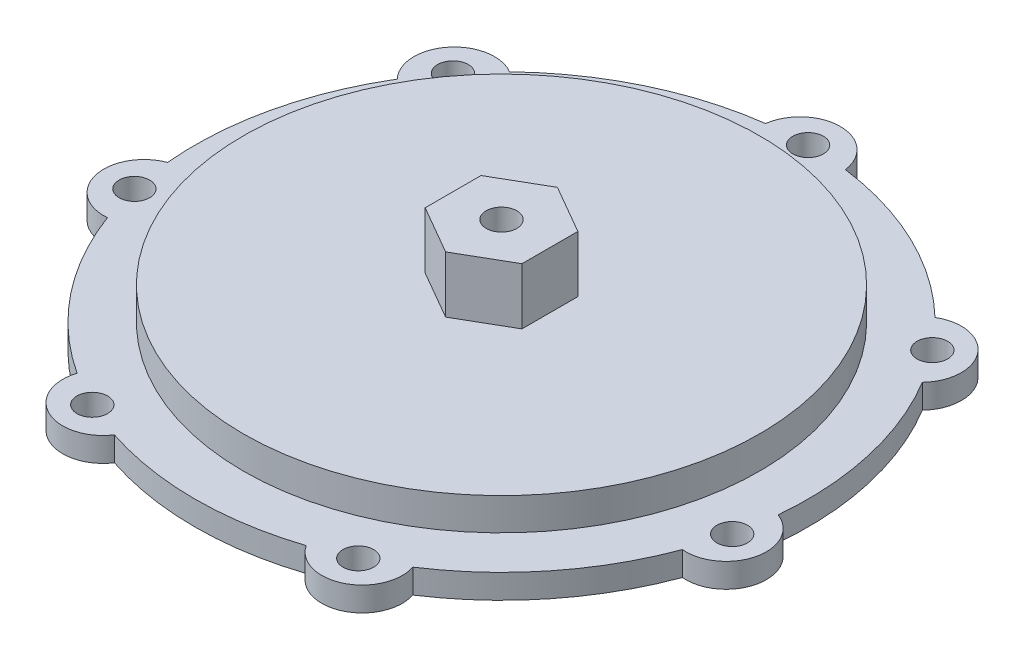
ISO-10303-21;
HEADER;
FILE_DESCRIPTION(('STEP AP214'),'2;1');
FILE_NAME('part.step','',(''),(''),'','','');
FILE_SCHEMA(('AUTOMOTIVE_DESIGN { 1 0 10303 214 1 1 1 1 }'));
ENDSEC;
DATA;
#1=APPLICATION_CONTEXT('core data for automotive mechanical design processes');
#2=APPLICATION_PROTOCOL_DEFINITION('international standard','automotive_design',2000,#1);
#3=PRODUCT_CONTEXT('',#1,'mechanical');
#4=PRODUCT('Part','Part','',(#3));
#5=PRODUCT_RELATED_PRODUCT_CATEGORY('part','',(#4));
#6=PRODUCT_DEFINITION_FORMATION('','',#4);
#7=PRODUCT_DEFINITION_CONTEXT('part definition',#1,'design');
#8=PRODUCT_DEFINITION('design','',#6,#7);
#9=PRODUCT_DEFINITION_SHAPE('','',#8);
#10=(LENGTH_UNIT() NAMED_UNIT(*) SI_UNIT(.MILLI.,.METRE.));
#11=(NAMED_UNIT(*) PLANE_ANGLE_UNIT() SI_UNIT($,.RADIAN.));
#12=(NAMED_UNIT(*) SI_UNIT($,.STERADIAN.) SOLID_ANGLE_UNIT());
#13=UNCERTAINTY_MEASURE_WITH_UNIT(LENGTH_MEASURE(1.E-05),#10,'distance_accuracy_value','');
#14=(GEOMETRIC_REPRESENTATION_CONTEXT(3) GLOBAL_UNCERTAINTY_ASSIGNED_CONTEXT((#13)) GLOBAL_UNIT_ASSIGNED_CONTEXT((#10,
#11,#12)) REPRESENTATION_CONTEXT('',''));
#15=CARTESIAN_POINT('',(0.,0.,0.));
#16=DIRECTION('',(0.,0.,1.));
#17=DIRECTION('',(1.,0.,0.));
#18=AXIS2_PLACEMENT_3D('',#15,#16,#17);
#19=CARTESIAN_POINT('',(0.,7.,0.));
#20=DIRECTION('',(0.,1.,0.));
#21=DIRECTION('',(0.,0.,1.));
#22=AXIS2_PLACEMENT_3D('',#19,#20,#21);
#23=PLANE('',#22);
#24=DIRECTION('',(-0.866025403784439,0.,0.5));
#25=VECTOR('',#24,1.);
#26=CARTESIAN_POINT('',(0.,7.,-6.92820323027551));
#27=LINE('',#26,#25);
#28=CARTESIAN_POINT('',(0.,7.,-6.92820323027551));
#29=VERTEX_POINT('',#28);
#30=CARTESIAN_POINT('',(-6.,7.,-3.46410161513776));
#31=VERTEX_POINT('',#30);
#32=EDGE_CURVE('E1307',#29,#31,#27,.T.);
#33=ORIENTED_EDGE('',*,*,#32,.F.);
#34=DIRECTION('',(-0.866025403784439,0.,-0.5));
#35=VECTOR('',#34,1.);
#36=CARTESIAN_POINT('',(6.,7.,-3.46410161513776));
#37=LINE('',#36,#35);
#38=CARTESIAN_POINT('',(6.,7.,-3.46410161513776));
#39=VERTEX_POINT('',#38);
#40=EDGE_CURVE('E1289',#39,#29,#37,.T.);
#41=ORIENTED_EDGE('',*,*,#40,.F.);
#42=DIRECTION('',(0.,0.,-1.));
#43=VECTOR('',#42,1.);
#44=CARTESIAN_POINT('',(6.,7.,3.46410161513776));
#45=LINE('',#44,#43);
#46=CARTESIAN_POINT('',(6.,7.,3.46410161513776));
#47=VERTEX_POINT('',#46);
#48=EDGE_CURVE('E1294',#47,#39,#45,.T.);
#49=ORIENTED_EDGE('',*,*,#48,.F.);
#50=DIRECTION('',(0.866025403784439,0.,-0.5));
#51=VECTOR('',#50,1.);
#52=CARTESIAN_POINT('',(0.,7.,6.92820323027551));
#53=LINE('',#52,#51);
#54=CARTESIAN_POINT('',(0.,7.,6.92820323027551));
#55=VERTEX_POINT('',#54);
#56=EDGE_CURVE('E1313',#55,#47,#53,.T.);
#57=ORIENTED_EDGE('',*,*,#56,.F.);
#58=DIRECTION('',(0.866025403784438,0.,0.5));
#59=VECTOR('',#58,1.);
#60=CARTESIAN_POINT('',(-6.,7.,3.46410161513775));
#61=LINE('',#60,#59);
#62=CARTESIAN_POINT('',(-6.,7.,3.46410161513775));
#63=VERTEX_POINT('',#62);
#64=EDGE_CURVE('E1311',#63,#55,#61,.T.);
#65=ORIENTED_EDGE('',*,*,#64,.F.);
#66=DIRECTION('',(0.,0.,1.));
#67=VECTOR('',#66,1.);
#68=CARTESIAN_POINT('',(-6.,7.,-3.46410161513776));
#69=LINE('',#68,#67);
#70=EDGE_CURVE('E1309',#31,#63,#69,.T.);
#71=ORIENTED_EDGE('',*,*,#70,.F.);
#72=EDGE_LOOP('',(#33,#41,#49,#57,#65,#71));
#73=FACE_BOUND('',#72,.T.);
#74=CARTESIAN_POINT('',(0.,7.00000000000001,0.));
#75=DIRECTION('',(0.,1.,0.));
#76=DIRECTION('',(0.,0.,1.));
#77=AXIS2_PLACEMENT_3D('',#74,#75,#76);
#78=CIRCLE('',#77,32.);
#79=CARTESIAN_POINT('',(0.,7.00000000000001,32.));
#80=VERTEX_POINT('',#79);
#81=EDGE_CURVE('E1003',#80,#80,#78,.T.);
#82=ORIENTED_EDGE('',*,*,#81,.T.);
#83=EDGE_LOOP('',(#82));
#84=FACE_BOUND('',#83,.T.);
#85=ADVANCED_FACE('F999',(#73,#84),#23,.T.);
#86=CARTESIAN_POINT('',(0.,7.,0.));
#87=DIRECTION('',(0.,-1.,0.));
#88=DIRECTION('',(0.,0.,-1.));
#89=AXIS2_PLACEMENT_3D('',#86,#87,#88);
#90=CYLINDRICAL_SURFACE('',#89,38.);
#91=CARTESIAN_POINT('',(0.,3.,0.));
#92=DIRECTION('',(0.,1.,0.));
#93=DIRECTION('',(0.,0.,1.));
#94=AXIS2_PLACEMENT_3D('',#91,#92,#93);
#95=CIRCLE('',#94,38.);
#96=CARTESIAN_POINT('',(-4.95413588643874,3.,-37.6756756756757));
#97=VERTEX_POINT('',#96);
#98=CARTESIAN_POINT('',(-26.3671761642809,3.,-27.3636989663637));
#99=VERTEX_POINT('',#98);
#100=EDGE_CURVE('E1147',#97,#99,#95,.T.);
#101=ORIENTED_EDGE('',*,*,#100,.F.);
#102=DIRECTION('',(0.,-1.,0.));
#103=VECTOR('',#102,1.);
#104=CARTESIAN_POINT('',(-4.95413588643874,41.8108108108108,-37.6756756756757));
#105=LINE('',#104,#103);
#106=CARTESIAN_POINT('',(-4.95413588643874,0.,-37.6756756756757));
#107=VERTEX_POINT('',#106);
#108=EDGE_CURVE('E1024',#97,#107,#105,.T.);
#109=ORIENTED_EDGE('',*,*,#108,.T.);
#110=CARTESIAN_POINT('',(0.,0.,0.));
#111=DIRECTION('',(0.,1.,0.));
#112=DIRECTION('',(0.,0.,1.));
#113=AXIS2_PLACEMENT_3D('',#110,#111,#112);
#114=CIRCLE('',#113,38.);
#115=CARTESIAN_POINT('',(-26.3671761642809,0.,-27.3636989663637));
#116=VERTEX_POINT('',#115);
#117=EDGE_CURVE('E13',#107,#116,#114,.T.);
#118=ORIENTED_EDGE('',*,*,#117,.T.);
#119=DIRECTION('',(0.,-1.,0.));
#120=VECTOR('',#119,1.);
#121=CARTESIAN_POINT('',(-26.3671761642809,42.3401581040992,-27.3636989663637));
#122=LINE('',#121,#120);
#123=EDGE_CURVE('E1164',#99,#116,#122,.T.);
#124=ORIENTED_EDGE('',*,*,#123,.F.);
#125=EDGE_LOOP('',(#101,#109,#118,#124));
#126=FACE_BOUND('',#125,.T.);
#127=ADVANCED_FACE('F1001',(#126),#90,.T.);
#128=CARTESIAN_POINT('',(0.,3.,0.));
#129=DIRECTION('',(0.,1.,0.));
#130=DIRECTION('',(0.,0.,1.));
#131=AXIS2_PLACEMENT_3D('',#128,#129,#130);
#132=CIRCLE('',#131,38.);
#133=CARTESIAN_POINT('',(-32.5448825687149,3.,-19.6171001574789));
#134=VERTEX_POINT('',#133);
#135=CARTESIAN_POINT('',(-37.8334667709229,3.,3.55370118235541));
#136=VERTEX_POINT('',#135);
#137=EDGE_CURVE('E1145',#134,#136,#132,.T.);
#138=ORIENTED_EDGE('',*,*,#137,.F.);
#139=DIRECTION('',(0.,-1.,0.));
#140=VECTOR('',#139,1.);
#141=CARTESIAN_POINT('',(-32.5448825687149,42.3401581040992,-19.6171001574789));
#142=LINE('',#141,#140);
#143=CARTESIAN_POINT('',(-32.5448825687149,0.,-19.6171001574789));
#144=VERTEX_POINT('',#143);
#145=EDGE_CURVE('E1156',#134,#144,#142,.T.);
#146=ORIENTED_EDGE('',*,*,#145,.T.);
#147=CARTESIAN_POINT('',(-37.8334667709229,0.,3.55370118235541));
#148=VERTEX_POINT('',#147);
#149=EDGE_CURVE('E1008',#144,#148,#114,.T.);
#150=ORIENTED_EDGE('',*,*,#149,.T.);
#151=DIRECTION('',(0.,-1.,0.));
#152=VECTOR('',#151,1.);
#153=CARTESIAN_POINT('',(-37.8334667709229,42.1052968000622,3.55370118235541));
#154=LINE('',#153,#152);
#155=EDGE_CURVE('E1158',#136,#148,#154,.T.);
#156=ORIENTED_EDGE('',*,*,#155,.F.);
#157=EDGE_LOOP('',(#138,#146,#150,#156));
#158=FACE_BOUND('',#157,.T.);
#159=ADVANCED_FACE('F1154',(#158),#90,.T.);
#160=CARTESIAN_POINT('',(0.,3.,0.));
#161=DIRECTION('',(0.,1.,0.));
#162=DIRECTION('',(0.,0.,1.));
#163=AXIS2_PLACEMENT_3D('',#160,#161,#162);
#164=CIRCLE('',#163,38.);
#165=CARTESIAN_POINT('',(-35.6286688821293,3.,13.213551895217));
#166=VERTEX_POINT('',#165);
#167=CARTESIAN_POINT('',(-20.8103852369823,3.,31.7950918584675));
#168=VERTEX_POINT('',#167);
#169=EDGE_CURVE('E1245',#166,#168,#164,.T.);
#170=ORIENTED_EDGE('',*,*,#169,.F.);
#171=DIRECTION('',(0.,-1.,0.));
#172=VECTOR('',#171,1.);
#173=CARTESIAN_POINT('',(-35.6286688821293,42.1052968000622,13.213551895217));
#174=LINE('',#173,#172);
#175=CARTESIAN_POINT('',(-35.6286688821293,0.,13.213551895217));
#176=VERTEX_POINT('',#175);
#177=EDGE_CURVE('E1179',#166,#176,#174,.T.);
#178=ORIENTED_EDGE('',*,*,#177,.T.);
#179=CARTESIAN_POINT('',(-20.8103852369823,0.,31.7950918584675));
#180=VERTEX_POINT('',#179);
#181=EDGE_CURVE('E1676',#176,#180,#114,.T.);
#182=ORIENTED_EDGE('',*,*,#181,.T.);
#183=DIRECTION('',(0.,-1.,0.));
#184=VECTOR('',#183,1.);
#185=CARTESIAN_POINT('',(-20.8103852369823,42.2639668536134,31.7950918584675));
#186=LINE('',#185,#184);
#187=EDGE_CURVE('E1175',#168,#180,#186,.T.);
#188=ORIENTED_EDGE('',*,*,#187,.F.);
#189=EDGE_LOOP('',(#170,#178,#182,#188));
#190=FACE_BOUND('',#189,.T.);
#191=ADVANCED_FACE('F1632',(#190),#90,.T.);
#192=CARTESIAN_POINT('',(0.,3.,0.));
#193=DIRECTION('',(0.,1.,0.));
#194=DIRECTION('',(0.,0.,1.));
#195=AXIS2_PLACEMENT_3D('',#192,#193,#194);
#196=CIRCLE('',#195,38.);
#197=CARTESIAN_POINT('',(-11.8833408349034,3.,36.0941298634767));
#198=VERTEX_POINT('',#197);
#199=CARTESIAN_POINT('',(11.8833408349029,3.,36.0941298634768));
#200=VERTEX_POINT('',#199);
#201=EDGE_CURVE('E1255',#198,#200,#196,.T.);
#202=ORIENTED_EDGE('',*,*,#201,.F.);
#203=DIRECTION('',(0.,-1.,0.));
#204=VECTOR('',#203,1.);
#205=CARTESIAN_POINT('',(-11.8833408349034,42.2639668536134,36.0941298634767));
#206=LINE('',#205,#204);
#207=CARTESIAN_POINT('',(-11.8833408349034,0.,36.0941298634767));
#208=VERTEX_POINT('',#207);
#209=EDGE_CURVE('E1189',#198,#208,#206,.T.);
#210=ORIENTED_EDGE('',*,*,#209,.T.);
#211=CARTESIAN_POINT('',(11.8833408349029,0.,36.0941298634768));
#212=VERTEX_POINT('',#211);
#213=EDGE_CURVE('E1680',#208,#212,#114,.T.);
#214=ORIENTED_EDGE('',*,*,#213,.T.);
#215=DIRECTION('',(0.,-1.,0.));
#216=VECTOR('',#215,1.);
#217=CARTESIAN_POINT('',(11.8833408349029,42.2639668536134,36.0941298634768));
#218=LINE('',#217,#216);
#219=EDGE_CURVE('E1185',#200,#212,#218,.T.);
#220=ORIENTED_EDGE('',*,*,#219,.F.);
#221=EDGE_LOOP('',(#202,#210,#214,#220));
#222=FACE_BOUND('',#221,.T.);
#223=ADVANCED_FACE('F1622',(#222),#90,.T.);
#224=CARTESIAN_POINT('',(0.,3.,0.));
#225=DIRECTION('',(0.,1.,0.));
#226=DIRECTION('',(0.,0.,1.));
#227=AXIS2_PLACEMENT_3D('',#224,#225,#226);
#228=CIRCLE('',#227,38.);
#229=CARTESIAN_POINT('',(20.8103852369819,3.,31.7950918584678));
#230=VERTEX_POINT('',#229);
#231=CARTESIAN_POINT('',(35.6286688821291,3.,13.2135518952175));
#232=VERTEX_POINT('',#231);
#233=EDGE_CURVE('E1262',#230,#232,#228,.T.);
#234=ORIENTED_EDGE('',*,*,#233,.F.);
#235=DIRECTION('',(0.,-1.,0.));
#236=VECTOR('',#235,1.);
#237=CARTESIAN_POINT('',(20.8103852369819,42.2639668536134,31.7950918584678));
#238=LINE('',#237,#236);
#239=CARTESIAN_POINT('',(20.8103852369819,0.,31.7950918584678));
#240=VERTEX_POINT('',#239);
#241=EDGE_CURVE('E1199',#230,#240,#238,.T.);
#242=ORIENTED_EDGE('',*,*,#241,.T.);
#243=CARTESIAN_POINT('',(35.6286688821291,0.,13.2135518952175));
#244=VERTEX_POINT('',#243);
#245=EDGE_CURVE('E1682',#240,#244,#114,.T.);
#246=ORIENTED_EDGE('',*,*,#245,.T.);
#247=DIRECTION('',(0.,-1.,0.));
#248=VECTOR('',#247,1.);
#249=CARTESIAN_POINT('',(35.6286688821291,42.1052968000622,13.2135518952175));
#250=LINE('',#249,#248);
#251=EDGE_CURVE('E1195',#232,#244,#250,.T.);
#252=ORIENTED_EDGE('',*,*,#251,.F.);
#253=EDGE_LOOP('',(#234,#242,#246,#252));
#254=FACE_BOUND('',#253,.T.);
#255=ADVANCED_FACE('F1612',(#254),#90,.T.);
#256=CARTESIAN_POINT('',(0.,3.,0.));
#257=DIRECTION('',(0.,1.,0.));
#258=DIRECTION('',(0.,0.,1.));
#259=AXIS2_PLACEMENT_3D('',#256,#257,#258);
#260=CIRCLE('',#259,38.);
#261=CARTESIAN_POINT('',(37.8334667709228,3.,3.55370118235592));
#262=VERTEX_POINT('',#261);
#263=CARTESIAN_POINT('',(32.5448825687152,3.,-19.6171001574784));
#264=VERTEX_POINT('',#263);
#265=EDGE_CURVE('E1251',#262,#264,#260,.T.);
#266=ORIENTED_EDGE('',*,*,#265,.F.);
#267=DIRECTION('',(0.,-1.,0.));
#268=VECTOR('',#267,1.);
#269=CARTESIAN_POINT('',(37.8334667709228,42.1052968000622,3.55370118235592));
#270=LINE('',#269,#268);
#271=CARTESIAN_POINT('',(37.8334667709228,0.,3.55370118235592));
#272=VERTEX_POINT('',#271);
#273=EDGE_CURVE('E1209',#262,#272,#270,.T.);
#274=ORIENTED_EDGE('',*,*,#273,.T.);
#275=CARTESIAN_POINT('',(32.5448825687152,0.,-19.6171001574784));
#276=VERTEX_POINT('',#275);
#277=EDGE_CURVE('E1685',#272,#276,#114,.T.);
#278=ORIENTED_EDGE('',*,*,#277,.T.);
#279=DIRECTION('',(0.,-1.,0.));
#280=VECTOR('',#279,1.);
#281=CARTESIAN_POINT('',(32.5448825687152,42.3401581040992,-19.6171001574784));
#282=LINE('',#281,#280);
#283=EDGE_CURVE('E1205',#264,#276,#282,.T.);
#284=ORIENTED_EDGE('',*,*,#283,.F.);
#285=EDGE_LOOP('',(#266,#274,#278,#284));
#286=FACE_BOUND('',#285,.T.);
#287=ADVANCED_FACE('F1602',(#286),#90,.T.);
#288=CARTESIAN_POINT('',(0.,3.,0.));
#289=DIRECTION('',(0.,1.,0.));
#290=DIRECTION('',(0.,0.,1.));
#291=AXIS2_PLACEMENT_3D('',#288,#289,#290);
#292=CIRCLE('',#291,38.);
#293=CARTESIAN_POINT('',(26.3671761642813,3.,-27.3636989663634));
#294=VERTEX_POINT('',#293);
#295=CARTESIAN_POINT('',(4.95413588643874,3.,-37.6756756756757));
#296=VERTEX_POINT('',#295);
#297=EDGE_CURVE('E1241',#294,#296,#292,.T.);
#298=ORIENTED_EDGE('',*,*,#297,.F.);
#299=DIRECTION('',(0.,-1.,0.));
#300=VECTOR('',#299,1.);
#301=CARTESIAN_POINT('',(26.3671761642813,42.3401581040992,-27.3636989663634));
#302=LINE('',#301,#300);
#303=CARTESIAN_POINT('',(26.3671761642813,0.,-27.3636989663634));
#304=VERTEX_POINT('',#303);
#305=EDGE_CURVE('E1219',#294,#304,#302,.T.);
#306=ORIENTED_EDGE('',*,*,#305,.T.);
#307=CARTESIAN_POINT('',(4.95413588643874,0.,-37.6756756756757));
#308=VERTEX_POINT('',#307);
#309=EDGE_CURVE('E1010',#304,#308,#114,.T.);
#310=ORIENTED_EDGE('',*,*,#309,.T.);
#311=DIRECTION('',(0.,-1.,0.));
#312=VECTOR('',#311,1.);
#313=CARTESIAN_POINT('',(4.95413588643874,41.8108108108108,-37.6756756756757));
#314=LINE('',#313,#312);
#315=EDGE_CURVE('E1215',#296,#308,#314,.T.);
#316=ORIENTED_EDGE('',*,*,#315,.F.);
#317=EDGE_LOOP('',(#298,#306,#310,#316));
#318=FACE_BOUND('',#317,.T.);
#319=ADVANCED_FACE('F1352',(#318),#90,.T.);
#320=CARTESIAN_POINT('',(0.,41.8108108108108,-37.));
#321=DIRECTION('',(0.,-1.,0.));
#322=DIRECTION('',(0.,0.,-1.));
#323=AXIS2_PLACEMENT_3D('',#320,#321,#322);
#324=CYLINDRICAL_SURFACE('',#323,5.);
#325=ORIENTED_EDGE('',*,*,#108,.F.);
#326=CARTESIAN_POINT('',(0.,3.,-37.));
#327=DIRECTION('',(0.,1.,0.));
#328=DIRECTION('',(0.,0.,1.));
#329=AXIS2_PLACEMENT_3D('',#326,#327,#328);
#330=CIRCLE('',#329,5.);
#331=EDGE_CURVE('E1238',#97,#296,#330,.F.);
#332=ORIENTED_EDGE('',*,*,#331,.T.);
#333=ORIENTED_EDGE('',*,*,#315,.T.);
#334=CARTESIAN_POINT('',(0.,0.,-37.));
#335=DIRECTION('',(0.,1.,0.));
#336=DIRECTION('',(0.,0.,1.));
#337=AXIS2_PLACEMENT_3D('',#334,#335,#336);
#338=CIRCLE('',#337,5.);
#339=EDGE_CURVE('E1225',#107,#308,#338,.F.);
#340=ORIENTED_EDGE('',*,*,#339,.F.);
#341=EDGE_LOOP('',(#325,#332,#333,#340));
#342=FACE_BOUND('',#341,.T.);
#343=ADVANCED_FACE('F1356',(#342),#324,.T.);
#344=CARTESIAN_POINT('',(0.,41.8108108108108,-38.));
#345=DIRECTION('',(0.,-1.,0.));
#346=DIRECTION('',(0.,0.,-1.));
#347=AXIS2_PLACEMENT_3D('',#344,#345,#346);
#348=CYLINDRICAL_SURFACE('',#347,1.9);
#349=CARTESIAN_POINT('',(0.,0.,-38.));
#350=DIRECTION('',(0.,1.,0.));
#351=DIRECTION('',(0.,0.,1.));
#352=AXIS2_PLACEMENT_3D('',#349,#350,#351);
#353=CIRCLE('',#352,1.9);
#354=CARTESIAN_POINT('',(0.,0.,-36.1));
#355=VERTEX_POINT('',#354);
#356=EDGE_CURVE('E1222',#355,#355,#353,.T.);
#357=ORIENTED_EDGE('',*,*,#356,.F.);
#358=EDGE_LOOP('',(#357));
#359=FACE_BOUND('',#358,.T.);
#360=CARTESIAN_POINT('',(0.,3.,-38.));
#361=DIRECTION('',(0.,1.,0.));
#362=DIRECTION('',(0.,0.,1.));
#363=AXIS2_PLACEMENT_3D('',#360,#361,#362);
#364=CIRCLE('',#363,1.9);
#365=CARTESIAN_POINT('',(0.,3.,-36.1));
#366=VERTEX_POINT('',#365);
#367=EDGE_CURVE('E1280',#366,#366,#364,.T.);
#368=ORIENTED_EDGE('',*,*,#367,.T.);
#369=EDGE_LOOP('',(#368));
#370=FACE_BOUND('',#369,.T.);
#371=ADVANCED_FACE('F1359',(#359,#370),#348,.F.);
#372=CARTESIAN_POINT('',(28.9277648513172,42.3401581040992,-23.0691226687731));
#373=DIRECTION('',(0.,-1.,0.));
#374=DIRECTION('',(0.,0.,-1.));
#375=AXIS2_PLACEMENT_3D('',#372,#373,#374);
#376=CYLINDRICAL_SURFACE('',#375,5.);
#377=ORIENTED_EDGE('',*,*,#305,.F.);
#378=CARTESIAN_POINT('',(28.9277648513172,3.,-23.0691226687731));
#379=DIRECTION('',(0.,1.,0.));
#380=DIRECTION('',(0.,0.,1.));
#381=AXIS2_PLACEMENT_3D('',#378,#379,#380);
#382=CIRCLE('',#381,5.);
#383=EDGE_CURVE('E1248',#294,#264,#382,.F.);
#384=ORIENTED_EDGE('',*,*,#383,.T.);
#385=ORIENTED_EDGE('',*,*,#283,.T.);
#386=CARTESIAN_POINT('',(28.9277648513172,0.,-23.0691226687731));
#387=DIRECTION('',(0.,1.,0.));
#388=DIRECTION('',(-0.781831482468031,0.,0.623489801858732));
#389=AXIS2_PLACEMENT_3D('',#386,#387,#388);
#390=CIRCLE('',#389,5.);
#391=EDGE_CURVE('E1216',#304,#276,#390,.F.);
#392=ORIENTED_EDGE('',*,*,#391,.F.);
#393=EDGE_LOOP('',(#377,#384,#385,#392));
#394=FACE_BOUND('',#393,.T.);
#395=ADVANCED_FACE('F1363',(#394),#376,.T.);
#396=CARTESIAN_POINT('',(29.7095963337852,42.3401581040992,-23.6926124706318));
#397=DIRECTION('',(0.,-1.,0.));
#398=DIRECTION('',(0.,0.,-1.));
#399=AXIS2_PLACEMENT_3D('',#396,#397,#398);
#400=CYLINDRICAL_SURFACE('',#399,1.9);
#401=CARTESIAN_POINT('',(29.7095963337852,0.,-23.6926124706318));
#402=DIRECTION('',(0.,1.,0.));
#403=DIRECTION('',(-0.781831482468031,0.,0.623489801858732));
#404=AXIS2_PLACEMENT_3D('',#401,#402,#403);
#405=CIRCLE('',#404,1.9);
#406=CARTESIAN_POINT('',(28.2241165170959,0.,-22.5079818471002));
#407=VERTEX_POINT('',#406);
#408=EDGE_CURVE('E1212',#407,#407,#405,.T.);
#409=ORIENTED_EDGE('',*,*,#408,.F.);
#410=EDGE_LOOP('',(#409));
#411=FACE_BOUND('',#410,.T.);
#412=CARTESIAN_POINT('',(29.7095963337852,3.,-23.6926124706318));
#413=DIRECTION('',(0.,1.,0.));
#414=DIRECTION('',(0.,0.,1.));
#415=AXIS2_PLACEMENT_3D('',#412,#413,#414);
#416=CIRCLE('',#415,1.9);
#417=CARTESIAN_POINT('',(29.7095963337852,3.,-21.7926124706318));
#418=VERTEX_POINT('',#417);
#419=EDGE_CURVE('E1277',#418,#418,#416,.T.);
#420=ORIENTED_EDGE('',*,*,#419,.T.);
#421=EDGE_LOOP('',(#420));
#422=FACE_BOUND('',#421,.T.);
#423=ADVANCED_FACE('F1367',(#411,#422),#400,.F.);
#424=CARTESIAN_POINT('',(36.0723327507274,42.1052968000622,8.23327455638378));
#425=DIRECTION('',(0.,-1.,0.));
#426=DIRECTION('',(0.,0.,-1.));
#427=AXIS2_PLACEMENT_3D('',#424,#425,#426);
#428=CYLINDRICAL_SURFACE('',#427,5.);
#429=ORIENTED_EDGE('',*,*,#273,.F.);
#430=CARTESIAN_POINT('',(36.0723327507274,3.,8.23327455638378));
#431=DIRECTION('',(0.,1.,0.));
#432=DIRECTION('',(0.,0.,1.));
#433=AXIS2_PLACEMENT_3D('',#430,#431,#432);
#434=CIRCLE('',#433,5.);
#435=EDGE_CURVE('E1260',#262,#232,#434,.F.);
#436=ORIENTED_EDGE('',*,*,#435,.T.);
#437=ORIENTED_EDGE('',*,*,#251,.T.);
#438=CARTESIAN_POINT('',(36.0723327507274,0.,8.23327455638378));
#439=DIRECTION('',(0.,1.,0.));
#440=DIRECTION('',(-0.974927912181823,0.,-0.222520933956318));
#441=AXIS2_PLACEMENT_3D('',#438,#439,#440);
#442=CIRCLE('',#441,5.);
#443=EDGE_CURVE('E1206',#272,#244,#442,.F.);
#444=ORIENTED_EDGE('',*,*,#443,.F.);
#445=EDGE_LOOP('',(#429,#436,#437,#444));
#446=FACE_BOUND('',#445,.T.);
#447=ADVANCED_FACE('F1371',(#446),#428,.T.);
#448=CARTESIAN_POINT('',(37.0472606629093,42.1052968000622,8.45579549034009));
#449=DIRECTION('',(0.,-1.,0.));
#450=DIRECTION('',(0.,0.,-1.));
#451=AXIS2_PLACEMENT_3D('',#448,#449,#450);
#452=CYLINDRICAL_SURFACE('',#451,1.9);
#453=CARTESIAN_POINT('',(37.0472606629093,0.,8.45579549034009));
#454=DIRECTION('',(0.,1.,0.));
#455=DIRECTION('',(-0.974927912181823,0.,-0.222520933956318));
#456=AXIS2_PLACEMENT_3D('',#453,#454,#455);
#457=CIRCLE('',#456,1.9);
#458=CARTESIAN_POINT('',(35.1948976297638,0.,8.03300571582309));
#459=VERTEX_POINT('',#458);
#460=EDGE_CURVE('E1202',#459,#459,#457,.T.);
#461=ORIENTED_EDGE('',*,*,#460,.F.);
#462=EDGE_LOOP('',(#461));
#463=FACE_BOUND('',#462,.T.);
#464=CARTESIAN_POINT('',(37.0472606629093,3.,8.45579549034009));
#465=DIRECTION('',(0.,1.,0.));
#466=DIRECTION('',(0.,0.,1.));
#467=AXIS2_PLACEMENT_3D('',#464,#465,#466);
#468=CIRCLE('',#467,1.9);
#469=CARTESIAN_POINT('',(37.0472606629093,3.,10.3557954903401));
#470=VERTEX_POINT('',#469);
#471=EDGE_CURVE('E1274',#470,#470,#468,.T.);
#472=ORIENTED_EDGE('',*,*,#471,.T.);
#473=EDGE_LOOP('',(#472));
#474=FACE_BOUND('',#473,.T.);
#475=ADVANCED_FACE('F1375',(#463,#474),#452,.F.);
#476=CARTESIAN_POINT('',(16.0536983473495,42.2639668536134,33.3358481123896));
#477=DIRECTION('',(0.,-1.,0.));
#478=DIRECTION('',(0.,0.,-1.));
#479=AXIS2_PLACEMENT_3D('',#476,#477,#478);
#480=CYLINDRICAL_SURFACE('',#479,5.);
#481=ORIENTED_EDGE('',*,*,#241,.F.);
#482=CARTESIAN_POINT('',(16.0536983473495,3.,33.3358481123896));
#483=DIRECTION('',(0.,1.,0.));
#484=DIRECTION('',(0.,0.,1.));
#485=AXIS2_PLACEMENT_3D('',#482,#483,#484);
#486=CIRCLE('',#485,5.);
#487=EDGE_CURVE('E1258',#230,#200,#486,.F.);
#488=ORIENTED_EDGE('',*,*,#487,.T.);
#489=ORIENTED_EDGE('',*,*,#219,.T.);
#490=CARTESIAN_POINT('',(16.0536983473495,0.,33.3358481123896));
#491=DIRECTION('',(0.,1.,0.));
#492=DIRECTION('',(-0.433883739117553,0.,-0.900968867902422));
#493=AXIS2_PLACEMENT_3D('',#490,#491,#492);
#494=CIRCLE('',#493,5.);
#495=EDGE_CURVE('E1196',#240,#212,#494,.F.);
#496=ORIENTED_EDGE('',*,*,#495,.F.);
#497=EDGE_LOOP('',(#481,#488,#489,#496));
#498=FACE_BOUND('',#497,.T.);
#499=ADVANCED_FACE('F1379',(#498),#480,.T.);
#500=CARTESIAN_POINT('',(16.487582086467,42.2639668536134,34.236816980292));
#501=DIRECTION('',(0.,-1.,0.));
#502=DIRECTION('',(0.,0.,-1.));
#503=AXIS2_PLACEMENT_3D('',#500,#501,#502);
#504=CYLINDRICAL_SURFACE('',#503,1.9);
#505=CARTESIAN_POINT('',(16.487582086467,0.,34.236816980292));
#506=DIRECTION('',(0.,1.,0.));
#507=DIRECTION('',(-0.433883739117553,0.,-0.900968867902422));
#508=AXIS2_PLACEMENT_3D('',#505,#506,#507);
#509=CIRCLE('',#508,1.9);
#510=CARTESIAN_POINT('',(15.6632029821437,0.,32.5249761312774));
#511=VERTEX_POINT('',#510);
#512=EDGE_CURVE('E1192',#511,#511,#509,.T.);
#513=ORIENTED_EDGE('',*,*,#512,.F.);
#514=EDGE_LOOP('',(#513));
#515=FACE_BOUND('',#514,.T.);
#516=CARTESIAN_POINT('',(16.487582086467,3.,34.236816980292));
#517=DIRECTION('',(0.,1.,0.));
#518=DIRECTION('',(0.,0.,1.));
#519=AXIS2_PLACEMENT_3D('',#516,#517,#518);
#520=CIRCLE('',#519,1.9);
#521=CARTESIAN_POINT('',(16.487582086467,3.,36.136816980292));
#522=VERTEX_POINT('',#521);
#523=EDGE_CURVE('E1271',#522,#522,#520,.T.);
#524=ORIENTED_EDGE('',*,*,#523,.T.);
#525=EDGE_LOOP('',(#524));
#526=FACE_BOUND('',#525,.T.);
#527=ADVANCED_FACE('F1383',(#515,#526),#504,.F.);
#528=CARTESIAN_POINT('',(-16.0536983473499,42.2639668536134,33.3358481123894));
#529=DIRECTION('',(0.,-1.,0.));
#530=DIRECTION('',(0.,0.,-1.));
#531=AXIS2_PLACEMENT_3D('',#528,#529,#530);
#532=CYLINDRICAL_SURFACE('',#531,5.);
#533=CARTESIAN_POINT('',(-16.0536983473499,3.,33.3358481123894));
#534=DIRECTION('',(0.,1.,0.));
#535=DIRECTION('',(0.,0.,1.));
#536=AXIS2_PLACEMENT_3D('',#533,#534,#535);
#537=CIRCLE('',#536,5.);
#538=EDGE_CURVE('E1249',#198,#168,#537,.F.);
#539=ORIENTED_EDGE('',*,*,#538,.T.);
#540=ORIENTED_EDGE('',*,*,#187,.T.);
#541=CARTESIAN_POINT('',(-16.0536983473499,0.,33.3358481123894));
#542=DIRECTION('',(0.,1.,0.));
#543=DIRECTION('',(0.433883739117565,0.,-0.900968867902416));
#544=AXIS2_PLACEMENT_3D('',#541,#542,#543);
#545=CIRCLE('',#544,5.);
#546=EDGE_CURVE('E1186',#208,#180,#545,.F.);
#547=ORIENTED_EDGE('',*,*,#546,.F.);
#548=ORIENTED_EDGE('',*,*,#209,.F.);
#549=EDGE_LOOP('',(#539,#540,#547,#548));
#550=FACE_BOUND('',#549,.T.);
#551=ADVANCED_FACE('F1387',(#550),#532,.T.);
#552=CARTESIAN_POINT('',(-16.4875820864675,42.2639668536134,34.2368169802918));
#553=DIRECTION('',(0.,-1.,0.));
#554=DIRECTION('',(0.,0.,-1.));
#555=AXIS2_PLACEMENT_3D('',#552,#553,#554);
#556=CYLINDRICAL_SURFACE('',#555,1.9);
#557=CARTESIAN_POINT('',(-16.4875820864675,0.,34.2368169802918));
#558=DIRECTION('',(0.,1.,0.));
#559=DIRECTION('',(0.433883739117565,0.,-0.900968867902416));
#560=AXIS2_PLACEMENT_3D('',#557,#558,#559);
#561=CIRCLE('',#560,1.9);
#562=CARTESIAN_POINT('',(-15.6632029821441,0.,32.5249761312772));
#563=VERTEX_POINT('',#562);
#564=EDGE_CURVE('E1182',#563,#563,#561,.T.);
#565=ORIENTED_EDGE('',*,*,#564,.F.);
#566=EDGE_LOOP('',(#565));
#567=FACE_BOUND('',#566,.T.);
#568=CARTESIAN_POINT('',(-16.4875820864675,3.,34.2368169802918));
#569=DIRECTION('',(0.,1.,0.));
#570=DIRECTION('',(0.,0.,1.));
#571=AXIS2_PLACEMENT_3D('',#568,#569,#570);
#572=CIRCLE('',#571,1.9);
#573=CARTESIAN_POINT('',(-16.4875820864675,3.,36.1368169802918));
#574=VERTEX_POINT('',#573);
#575=EDGE_CURVE('E1268',#574,#574,#572,.T.);
#576=ORIENTED_EDGE('',*,*,#575,.T.);
#577=EDGE_LOOP('',(#576));
#578=FACE_BOUND('',#577,.T.);
#579=ADVANCED_FACE('F1391',(#567,#578),#556,.F.);
#580=CARTESIAN_POINT('',(-36.0723327507276,42.1052968000622,8.23327455638329));
#581=DIRECTION('',(0.,-1.,0.));
#582=DIRECTION('',(0.,0.,-1.));
#583=AXIS2_PLACEMENT_3D('',#580,#581,#582);
#584=CYLINDRICAL_SURFACE('',#583,5.);
#585=CARTESIAN_POINT('',(-36.0723327507276,3.,8.23327455638329));
#586=DIRECTION('',(0.,1.,0.));
#587=DIRECTION('',(0.,0.,1.));
#588=AXIS2_PLACEMENT_3D('',#585,#586,#587);
#589=CIRCLE('',#588,5.);
#590=EDGE_CURVE('E1239',#166,#136,#589,.F.);
#591=ORIENTED_EDGE('',*,*,#590,.T.);
#592=ORIENTED_EDGE('',*,*,#155,.T.);
#593=CARTESIAN_POINT('',(-36.0723327507276,0.,8.23327455638329));
#594=DIRECTION('',(0.,1.,0.));
#595=DIRECTION('',(0.974927912181826,0.,-0.222520933956305));
#596=AXIS2_PLACEMENT_3D('',#593,#594,#595);
#597=CIRCLE('',#596,5.);
#598=EDGE_CURVE('E1176',#176,#148,#597,.F.);
#599=ORIENTED_EDGE('',*,*,#598,.F.);
#600=ORIENTED_EDGE('',*,*,#177,.F.);
#601=EDGE_LOOP('',(#591,#592,#599,#600));
#602=FACE_BOUND('',#601,.T.);
#603=ADVANCED_FACE('F1395',(#602),#584,.T.);
#604=CARTESIAN_POINT('',(-37.0472606629094,42.1052968000622,8.45579549033959));
#605=DIRECTION('',(0.,-1.,0.));
#606=DIRECTION('',(0.,0.,-1.));
#607=AXIS2_PLACEMENT_3D('',#604,#605,#606);
#608=CYLINDRICAL_SURFACE('',#607,1.9);
#609=CARTESIAN_POINT('',(-37.0472606629094,0.,8.45579549033959));
#610=DIRECTION('',(0.,1.,0.));
#611=DIRECTION('',(0.974927912181826,0.,-0.222520933956305));
#612=AXIS2_PLACEMENT_3D('',#609,#610,#611);
#613=CIRCLE('',#612,1.9);
#614=CARTESIAN_POINT('',(-35.1948976297639,0.,8.03300571582261));
#615=VERTEX_POINT('',#614);
#616=EDGE_CURVE('E1172',#615,#615,#613,.T.);
#617=ORIENTED_EDGE('',*,*,#616,.F.);
#618=EDGE_LOOP('',(#617));
#619=FACE_BOUND('',#618,.T.);
#620=CARTESIAN_POINT('',(-37.0472606629094,3.,8.45579549033959));
#621=DIRECTION('',(0.,1.,0.));
#622=DIRECTION('',(0.,0.,1.));
#623=AXIS2_PLACEMENT_3D('',#620,#621,#622);
#624=CIRCLE('',#623,1.9);
#625=CARTESIAN_POINT('',(-37.0472606629094,3.,10.3557954903396));
#626=VERTEX_POINT('',#625);
#627=EDGE_CURVE('E1265',#626,#626,#624,.T.);
#628=ORIENTED_EDGE('',*,*,#627,.T.);
#629=EDGE_LOOP('',(#628));
#630=FACE_BOUND('',#629,.T.);
#631=ADVANCED_FACE('F1343',(#619,#630),#608,.F.);
#632=CARTESIAN_POINT('',(-28.9277648513168,42.3401581040992,-23.0691226687735));
#633=DIRECTION('',(0.,-1.,0.));
#634=DIRECTION('',(0.,0.,-1.));
#635=AXIS2_PLACEMENT_3D('',#632,#633,#634);
#636=CYLINDRICAL_SURFACE('',#635,5.);
#637=CARTESIAN_POINT('',(-28.9277648513168,3.,-23.0691226687735));
#638=DIRECTION('',(0.,1.,0.));
#639=DIRECTION('',(0.,0.,1.));
#640=AXIS2_PLACEMENT_3D('',#637,#638,#639);
#641=CIRCLE('',#640,5.);
#642=EDGE_CURVE('E1141',#134,#99,#641,.F.);
#643=ORIENTED_EDGE('',*,*,#642,.T.);
#644=ORIENTED_EDGE('',*,*,#123,.T.);
#645=CARTESIAN_POINT('',(-28.9277648513168,0.,-23.0691226687735));
#646=DIRECTION('',(0.,1.,0.));
#647=DIRECTION('',(0.781831482468022,0.,0.623489801858743));
#648=AXIS2_PLACEMENT_3D('',#645,#646,#647);
#649=CIRCLE('',#648,5.);
#650=EDGE_CURVE('E1162',#144,#116,#649,.F.);
#651=ORIENTED_EDGE('',*,*,#650,.F.);
#652=ORIENTED_EDGE('',*,*,#145,.F.);
#653=EDGE_LOOP('',(#643,#644,#651,#652));
#654=FACE_BOUND('',#653,.T.);
#655=ADVANCED_FACE('F1160',(#654),#636,.T.);
#656=CARTESIAN_POINT('',(-29.7095963337848,42.3401581040992,-23.6926124706322));
#657=DIRECTION('',(0.,-1.,0.));
#658=DIRECTION('',(0.,0.,-1.));
#659=AXIS2_PLACEMENT_3D('',#656,#657,#658);
#660=CYLINDRICAL_SURFACE('',#659,1.9);
#661=CARTESIAN_POINT('',(-29.7095963337848,0.,-23.6926124706322));
#662=DIRECTION('',(0.,1.,0.));
#663=DIRECTION('',(0.781831482468022,0.,0.623489801858743));
#664=AXIS2_PLACEMENT_3D('',#661,#662,#663);
#665=CIRCLE('',#664,1.9);
#666=CARTESIAN_POINT('',(-28.2241165170956,0.,-22.5079818471006));
#667=VERTEX_POINT('',#666);
#668=EDGE_CURVE('E1166',#667,#667,#665,.T.);
#669=ORIENTED_EDGE('',*,*,#668,.F.);
#670=EDGE_LOOP('',(#669));
#671=FACE_BOUND('',#670,.T.);
#672=CARTESIAN_POINT('',(-29.7095963337848,3.,-23.6926124706322));
#673=DIRECTION('',(0.,1.,0.));
#674=DIRECTION('',(0.,0.,1.));
#675=AXIS2_PLACEMENT_3D('',#672,#673,#674);
#676=CIRCLE('',#675,1.9);
#677=CARTESIAN_POINT('',(-29.7095963337848,3.,-21.7926124706322));
#678=VERTEX_POINT('',#677);
#679=EDGE_CURVE('E1151',#678,#678,#676,.T.);
#680=ORIENTED_EDGE('',*,*,#679,.T.);
#681=EDGE_LOOP('',(#680));
#682=FACE_BOUND('',#681,.T.);
#683=ADVANCED_FACE('F1334',(#671,#682),#660,.F.);
#684=CARTESIAN_POINT('',(0.,0.,0.));
#685=DIRECTION('',(0.,1.,0.));
#686=DIRECTION('',(0.,0.,1.));
#687=AXIS2_PLACEMENT_3D('',#684,#685,#686);
#688=PLANE('',#687);
#689=CARTESIAN_POINT('',(0.,0.,0.));
#690=DIRECTION('',(0.,1.,0.));
#691=DIRECTION('',(0.,0.,1.));
#692=AXIS2_PLACEMENT_3D('',#689,#690,#691);
#693=CIRCLE('',#692,1.9);
#694=CARTESIAN_POINT('',(0.,0.,1.9));
#695=VERTEX_POINT('',#694);
#696=EDGE_CURVE('E1283',#695,#695,#693,.T.);
#697=ORIENTED_EDGE('',*,*,#696,.T.);
#698=EDGE_LOOP('',(#697));
#699=FACE_BOUND('',#698,.T.);
#700=ORIENTED_EDGE('',*,*,#668,.T.);
#701=EDGE_LOOP('',(#700));
#702=FACE_BOUND('',#701,.T.);
#703=ORIENTED_EDGE('',*,*,#616,.T.);
#704=EDGE_LOOP('',(#703));
#705=FACE_BOUND('',#704,.T.);
#706=ORIENTED_EDGE('',*,*,#564,.T.);
#707=EDGE_LOOP('',(#706));
#708=FACE_BOUND('',#707,.T.);
#709=ORIENTED_EDGE('',*,*,#512,.T.);
#710=EDGE_LOOP('',(#709));
#711=FACE_BOUND('',#710,.T.);
#712=ORIENTED_EDGE('',*,*,#460,.T.);
#713=EDGE_LOOP('',(#712));
#714=FACE_BOUND('',#713,.T.);
#715=ORIENTED_EDGE('',*,*,#408,.T.);
#716=EDGE_LOOP('',(#715));
#717=FACE_BOUND('',#716,.T.);
#718=ORIENTED_EDGE('',*,*,#356,.T.);
#719=EDGE_LOOP('',(#718));
#720=FACE_BOUND('',#719,.T.);
#721=ORIENTED_EDGE('',*,*,#117,.F.);
#722=ORIENTED_EDGE('',*,*,#339,.T.);
#723=ORIENTED_EDGE('',*,*,#309,.F.);
#724=ORIENTED_EDGE('',*,*,#391,.T.);
#725=ORIENTED_EDGE('',*,*,#277,.F.);
#726=ORIENTED_EDGE('',*,*,#443,.T.);
#727=ORIENTED_EDGE('',*,*,#245,.F.);
#728=ORIENTED_EDGE('',*,*,#495,.T.);
#729=ORIENTED_EDGE('',*,*,#213,.F.);
#730=ORIENTED_EDGE('',*,*,#546,.T.);
#731=ORIENTED_EDGE('',*,*,#181,.F.);
#732=ORIENTED_EDGE('',*,*,#598,.T.);
#733=ORIENTED_EDGE('',*,*,#149,.F.);
#734=ORIENTED_EDGE('',*,*,#650,.T.);
#735=EDGE_LOOP('',(#721,#722,#723,#724,#725,#726,#727,#728,#729,#730,#731,#732,#733,#734));
#736=FACE_BOUND('',#735,.T.);
#737=ADVANCED_FACE('F1331',(#699,#702,#705,#708,#711,#714,#717,#720,#736),#688,.F.);
#738=CARTESIAN_POINT('',(6.,14.,-3.46410161513776));
#739=DIRECTION('',(-0.5,0.,0.866025403784439));
#740=DIRECTION('',(0.866025403784439,0.,0.5));
#741=AXIS2_PLACEMENT_3D('',#738,#739,#740);
#742=PLANE('',#741);
#743=ORIENTED_EDGE('',*,*,#40,.T.);
#744=DIRECTION('',(0.,-1.,0.));
#745=VECTOR('',#744,1.);
#746=CARTESIAN_POINT('',(0.,14.,-6.92820323027551));
#747=LINE('',#746,#745);
#748=CARTESIAN_POINT('',(0.,14.,-6.92820323027551));
#749=VERTEX_POINT('',#748);
#750=EDGE_CURVE('E1168',#749,#29,#747,.T.);
#751=ORIENTED_EDGE('',*,*,#750,.F.);
#752=DIRECTION('',(-0.866025403784439,0.,-0.5));
#753=VECTOR('',#752,1.);
#754=CARTESIAN_POINT('',(6.,14.,-3.46410161513776));
#755=LINE('',#754,#753);
#756=CARTESIAN_POINT('',(6.,14.,-3.46410161513776));
#757=VERTEX_POINT('',#756);
#758=EDGE_CURVE('E1290',#757,#749,#755,.T.);
#759=ORIENTED_EDGE('',*,*,#758,.F.);
#760=DIRECTION('',(0.,-1.,0.));
#761=VECTOR('',#760,1.);
#762=CARTESIAN_POINT('',(6.,14.,-3.46410161513776));
#763=LINE('',#762,#761);
#764=EDGE_CURVE('E1304',#757,#39,#763,.T.);
#765=ORIENTED_EDGE('',*,*,#764,.T.);
#766=EDGE_LOOP('',(#743,#751,#759,#765));
#767=FACE_BOUND('',#766,.T.);
#768=ADVANCED_FACE('F1341',(#767),#742,.F.);
#769=CARTESIAN_POINT('',(0.,14.,-6.92820323027551));
#770=DIRECTION('',(0.5,0.,0.866025403784439));
#771=DIRECTION('',(0.866025403784439,0.,-0.5));
#772=AXIS2_PLACEMENT_3D('',#769,#770,#771);
#773=PLANE('',#772);
#774=ORIENTED_EDGE('',*,*,#32,.T.);
#775=DIRECTION('',(0.,-1.,0.));
#776=VECTOR('',#775,1.);
#777=CARTESIAN_POINT('',(-6.,14.,-3.46410161513776));
#778=LINE('',#777,#776);
#779=CARTESIAN_POINT('',(-6.,14.,-3.46410161513776));
#780=VERTEX_POINT('',#779);
#781=EDGE_CURVE('E1325',#780,#31,#778,.T.);
#782=ORIENTED_EDGE('',*,*,#781,.F.);
#783=DIRECTION('',(-0.866025403784439,0.,0.5));
#784=VECTOR('',#783,1.);
#785=CARTESIAN_POINT('',(0.,14.,-6.92820323027551));
#786=LINE('',#785,#784);
#787=EDGE_CURVE('E1293',#749,#780,#786,.T.);
#788=ORIENTED_EDGE('',*,*,#787,.F.);
#789=ORIENTED_EDGE('',*,*,#750,.T.);
#790=EDGE_LOOP('',(#774,#782,#788,#789));
#791=FACE_BOUND('',#790,.T.);
#792=ADVANCED_FACE('F1443',(#791),#773,.F.);
#793=CARTESIAN_POINT('',(-6.,14.,-3.46410161513776));
#794=DIRECTION('',(1.,0.,0.));
#795=DIRECTION('',(0.,0.,-1.));
#796=AXIS2_PLACEMENT_3D('',#793,#794,#795);
#797=PLANE('',#796);
#798=ORIENTED_EDGE('',*,*,#70,.T.);
#799=DIRECTION('',(0.,-1.,0.));
#800=VECTOR('',#799,1.);
#801=CARTESIAN_POINT('',(-6.,14.,3.46410161513775));
#802=LINE('',#801,#800);
#803=CARTESIAN_POINT('',(-6.,14.,3.46410161513775));
#804=VERTEX_POINT('',#803);
#805=EDGE_CURVE('E1322',#804,#63,#802,.T.);
#806=ORIENTED_EDGE('',*,*,#805,.F.);
#807=DIRECTION('',(0.,0.,1.));
#808=VECTOR('',#807,1.);
#809=CARTESIAN_POINT('',(-6.,14.,-3.46410161513776));
#810=LINE('',#809,#808);
#811=EDGE_CURVE('E1296',#780,#804,#810,.T.);
#812=ORIENTED_EDGE('',*,*,#811,.F.);
#813=ORIENTED_EDGE('',*,*,#781,.T.);
#814=EDGE_LOOP('',(#798,#806,#812,#813));
#815=FACE_BOUND('',#814,.T.);
#816=ADVANCED_FACE('F1439',(#815),#797,.F.);
#817=CARTESIAN_POINT('',(-6.,14.,3.46410161513775));
#818=DIRECTION('',(0.5,0.,-0.866025403784438));
#819=DIRECTION('',(-0.866025403784439,0.,-0.5));
#820=AXIS2_PLACEMENT_3D('',#817,#818,#819);
#821=PLANE('',#820);
#822=ORIENTED_EDGE('',*,*,#64,.T.);
#823=DIRECTION('',(0.,-1.,0.));
#824=VECTOR('',#823,1.);
#825=CARTESIAN_POINT('',(0.,14.,6.92820323027551));
#826=LINE('',#825,#824);
#827=CARTESIAN_POINT('',(0.,14.,6.92820323027551));
#828=VERTEX_POINT('',#827);
#829=EDGE_CURVE('E1319',#828,#55,#826,.T.);
#830=ORIENTED_EDGE('',*,*,#829,.F.);
#831=DIRECTION('',(0.866025403784438,0.,0.5));
#832=VECTOR('',#831,1.);
#833=CARTESIAN_POINT('',(-6.,14.,3.46410161513775));
#834=LINE('',#833,#832);
#835=EDGE_CURVE('E1298',#804,#828,#834,.T.);
#836=ORIENTED_EDGE('',*,*,#835,.F.);
#837=ORIENTED_EDGE('',*,*,#805,.T.);
#838=EDGE_LOOP('',(#822,#830,#836,#837));
#839=FACE_BOUND('',#838,.T.);
#840=ADVANCED_FACE('F1435',(#839),#821,.F.);
#841=CARTESIAN_POINT('',(0.,14.,6.92820323027551));
#842=DIRECTION('',(-0.5,0.,-0.866025403784439));
#843=DIRECTION('',(-0.866025403784439,0.,0.5));
#844=AXIS2_PLACEMENT_3D('',#841,#842,#843);
#845=PLANE('',#844);
#846=ORIENTED_EDGE('',*,*,#56,.T.);
#847=DIRECTION('',(0.,-1.,0.));
#848=VECTOR('',#847,1.);
#849=CARTESIAN_POINT('',(6.,14.,3.46410161513776));
#850=LINE('',#849,#848);
#851=CARTESIAN_POINT('',(6.,14.,3.46410161513776));
#852=VERTEX_POINT('',#851);
#853=EDGE_CURVE('E1017',#852,#47,#850,.T.);
#854=ORIENTED_EDGE('',*,*,#853,.F.);
#855=DIRECTION('',(0.866025403784439,0.,-0.5));
#856=VECTOR('',#855,1.);
#857=CARTESIAN_POINT('',(0.,14.,6.92820323027551));
#858=LINE('',#857,#856);
#859=EDGE_CURVE('E1300',#828,#852,#858,.T.);
#860=ORIENTED_EDGE('',*,*,#859,.F.);
#861=ORIENTED_EDGE('',*,*,#829,.T.);
#862=EDGE_LOOP('',(#846,#854,#860,#861));
#863=FACE_BOUND('',#862,.T.);
#864=ADVANCED_FACE('F1432',(#863),#845,.F.);
#865=CARTESIAN_POINT('',(6.,14.,3.46410161513776));
#866=DIRECTION('',(-1.,0.,0.));
#867=DIRECTION('',(0.,0.,1.));
#868=AXIS2_PLACEMENT_3D('',#865,#866,#867);
#869=PLANE('',#868);
#870=ORIENTED_EDGE('',*,*,#48,.T.);
#871=ORIENTED_EDGE('',*,*,#764,.F.);
#872=DIRECTION('',(0.,0.,-1.));
#873=VECTOR('',#872,1.);
#874=CARTESIAN_POINT('',(6.,14.,3.46410161513776));
#875=LINE('',#874,#873);
#876=EDGE_CURVE('E1302',#852,#757,#875,.T.);
#877=ORIENTED_EDGE('',*,*,#876,.F.);
#878=ORIENTED_EDGE('',*,*,#853,.T.);
#879=EDGE_LOOP('',(#870,#871,#877,#878));
#880=FACE_BOUND('',#879,.T.);
#881=ADVANCED_FACE('F1428',(#880),#869,.F.);
#882=CARTESIAN_POINT('',(0.,14.,0.));
#883=DIRECTION('',(0.,1.,0.));
#884=DIRECTION('',(0.,0.,1.));
#885=AXIS2_PLACEMENT_3D('',#882,#883,#884);
#886=PLANE('',#885);
#887=CARTESIAN_POINT('',(0.,14.,0.));
#888=DIRECTION('',(0.,1.,0.));
#889=DIRECTION('',(0.,0.,1.));
#890=AXIS2_PLACEMENT_3D('',#887,#888,#889);
#891=CIRCLE('',#890,1.9);
#892=CARTESIAN_POINT('',(0.,14.,1.9));
#893=VERTEX_POINT('',#892);
#894=EDGE_CURVE('E1286',#893,#893,#891,.T.);
#895=ORIENTED_EDGE('',*,*,#894,.F.);
#896=EDGE_LOOP('',(#895));
#897=FACE_BOUND('',#896,.T.);
#898=ORIENTED_EDGE('',*,*,#758,.T.);
#899=ORIENTED_EDGE('',*,*,#787,.T.);
#900=ORIENTED_EDGE('',*,*,#811,.T.);
#901=ORIENTED_EDGE('',*,*,#835,.T.);
#902=ORIENTED_EDGE('',*,*,#859,.T.);
#903=ORIENTED_EDGE('',*,*,#876,.T.);
#904=EDGE_LOOP('',(#898,#899,#900,#901,#902,#903));
#905=FACE_BOUND('',#904,.T.);
#906=ADVANCED_FACE('F1424',(#897,#905),#886,.T.);
#907=CARTESIAN_POINT('',(0.,19.3740115370178,0.));
#908=DIRECTION('',(0.,-1.,0.));
#909=DIRECTION('',(0.,0.,-1.));
#910=AXIS2_PLACEMENT_3D('',#907,#908,#909);
#911=CYLINDRICAL_SURFACE('',#910,1.9);
#912=ORIENTED_EDGE('',*,*,#696,.F.);
#913=EDGE_LOOP('',(#912));
#914=FACE_BOUND('',#913,.T.);
#915=ORIENTED_EDGE('',*,*,#894,.T.);
#916=EDGE_LOOP('',(#915));
#917=FACE_BOUND('',#916,.T.);
#918=ADVANCED_FACE('F1416',(#914,#917),#911,.F.);
#919=CARTESIAN_POINT('',(0.,-118.79393923934,0.));
#920=DIRECTION('',(0.,1.,0.));
#921=DIRECTION('',(0.,0.,1.));
#922=AXIS2_PLACEMENT_3D('',#919,#920,#921);
#923=CYLINDRICAL_SURFACE('',#922,32.);
#924=ORIENTED_EDGE('',*,*,#81,.F.);
#925=EDGE_LOOP('',(#924));
#926=FACE_BOUND('',#925,.T.);
#927=CARTESIAN_POINT('',(0.,3.,0.));
#928=DIRECTION('',(0.,1.,0.));
#929=DIRECTION('',(0.,0.,1.));
#930=AXIS2_PLACEMENT_3D('',#927,#928,#929);
#931=CIRCLE('',#930,32.);
#932=CARTESIAN_POINT('',(0.,3.,32.));
#933=VERTEX_POINT('',#932);
#934=EDGE_CURVE('E1230',#933,#933,#931,.F.);
#935=ORIENTED_EDGE('',*,*,#934,.F.);
#936=EDGE_LOOP('',(#935));
#937=FACE_BOUND('',#936,.T.);
#938=ADVANCED_FACE('F1410',(#926,#937),#923,.T.);
#939=CARTESIAN_POINT('',(0.,3.,0.));
#940=DIRECTION('',(0.,1.,0.));
#941=DIRECTION('',(0.,0.,1.));
#942=AXIS2_PLACEMENT_3D('',#939,#940,#941);
#943=PLANE('',#942);
#944=ORIENTED_EDGE('',*,*,#367,.F.);
#945=EDGE_LOOP('',(#944));
#946=FACE_BOUND('',#945,.T.);
#947=ORIENTED_EDGE('',*,*,#419,.F.);
#948=EDGE_LOOP('',(#947));
#949=FACE_BOUND('',#948,.T.);
#950=ORIENTED_EDGE('',*,*,#471,.F.);
#951=EDGE_LOOP('',(#950));
#952=FACE_BOUND('',#951,.T.);
#953=ORIENTED_EDGE('',*,*,#523,.F.);
#954=EDGE_LOOP('',(#953));
#955=FACE_BOUND('',#954,.T.);
#956=ORIENTED_EDGE('',*,*,#575,.F.);
#957=EDGE_LOOP('',(#956));
#958=FACE_BOUND('',#957,.T.);
#959=ORIENTED_EDGE('',*,*,#627,.F.);
#960=EDGE_LOOP('',(#959));
#961=FACE_BOUND('',#960,.T.);
#962=ORIENTED_EDGE('',*,*,#679,.F.);
#963=EDGE_LOOP('',(#962));
#964=FACE_BOUND('',#963,.T.);
#965=ORIENTED_EDGE('',*,*,#435,.F.);
#966=ORIENTED_EDGE('',*,*,#265,.T.);
#967=ORIENTED_EDGE('',*,*,#383,.F.);
#968=ORIENTED_EDGE('',*,*,#297,.T.);
#969=ORIENTED_EDGE('',*,*,#331,.F.);
#970=ORIENTED_EDGE('',*,*,#100,.T.);
#971=ORIENTED_EDGE('',*,*,#642,.F.);
#972=ORIENTED_EDGE('',*,*,#137,.T.);
#973=ORIENTED_EDGE('',*,*,#590,.F.);
#974=ORIENTED_EDGE('',*,*,#169,.T.);
#975=ORIENTED_EDGE('',*,*,#538,.F.);
#976=ORIENTED_EDGE('',*,*,#201,.T.);
#977=ORIENTED_EDGE('',*,*,#487,.F.);
#978=ORIENTED_EDGE('',*,*,#233,.T.);
#979=EDGE_LOOP('',(#965,#966,#967,#968,#969,#970,#971,#972,#973,#974,#975,#976,#977,#978));
#980=FACE_BOUND('',#979,.T.);
#981=ORIENTED_EDGE('',*,*,#934,.T.);
#982=EDGE_LOOP('',(#981));
#983=FACE_BOUND('',#982,.T.);
#984=ADVANCED_FACE('F1143',(#946,#949,#952,#955,#958,#961,#964,#980,#983),#943,.T.);
#985=CLOSED_SHELL('',(#85,#127,#159,#191,#223,#255,#287,#319,#343,#371,#395,#423,#447,#475,#499,
#527,#551,#579,#603,#631,#655,#683,#737,#768,#792,#816,#840,#864,#881,#906,#918,#938,#984));
#986=MANIFOLD_SOLID_BREP('B2',#985);
#987=ADVANCED_BREP_SHAPE_REPRESENTATION('',(#18,#986),#14);
#988=SHAPE_DEFINITION_REPRESENTATION(#9,#987);
ENDSEC;
END-ISO-10303-21;
